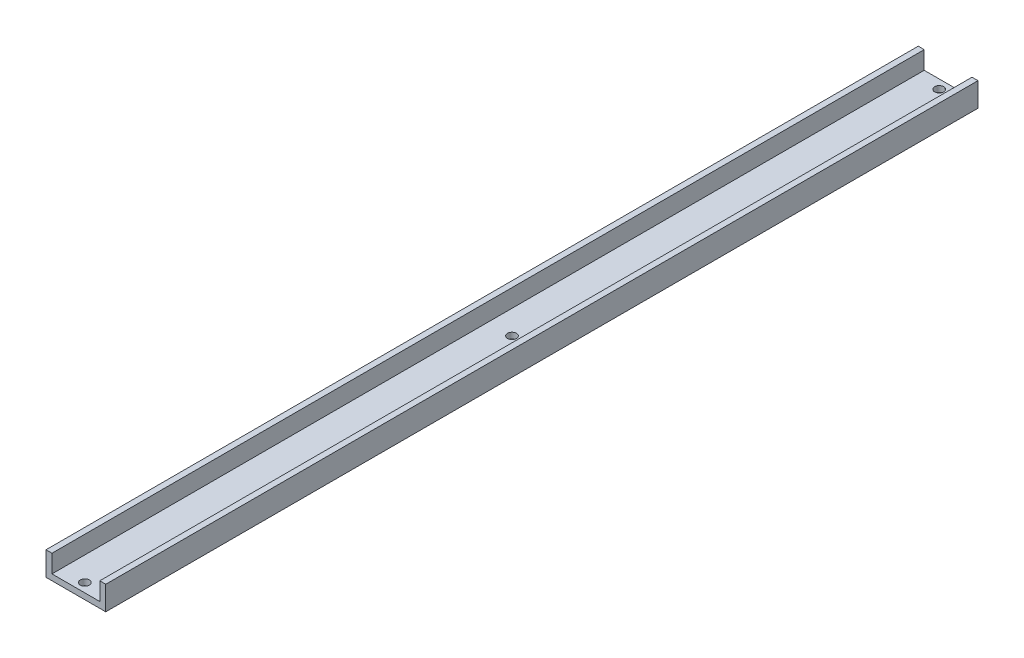
ISO-10303-21;
HEADER;
FILE_DESCRIPTION(('STEP AP214'),'2;1');
FILE_NAME('part.step','',(''),(''),'','','');
FILE_SCHEMA(('AUTOMOTIVE_DESIGN { 1 0 10303 214 1 1 1 1 }'));
ENDSEC;
DATA;
#1=APPLICATION_CONTEXT('core data for automotive mechanical design processes');
#2=APPLICATION_PROTOCOL_DEFINITION('international standard','automotive_design',2000,#1);
#3=PRODUCT_CONTEXT('',#1,'mechanical');
#4=PRODUCT('Part','Part','',(#3));
#5=PRODUCT_RELATED_PRODUCT_CATEGORY('part','',(#4));
#6=PRODUCT_DEFINITION_FORMATION('','',#4);
#7=PRODUCT_DEFINITION_CONTEXT('part definition',#1,'design');
#8=PRODUCT_DEFINITION('design','',#6,#7);
#9=PRODUCT_DEFINITION_SHAPE('','',#8);
#10=(LENGTH_UNIT() NAMED_UNIT(*) SI_UNIT(.MILLI.,.METRE.));
#11=(NAMED_UNIT(*) PLANE_ANGLE_UNIT() SI_UNIT($,.RADIAN.));
#12=(NAMED_UNIT(*) SI_UNIT($,.STERADIAN.) SOLID_ANGLE_UNIT());
#13=UNCERTAINTY_MEASURE_WITH_UNIT(LENGTH_MEASURE(1.E-05),#10,'distance_accuracy_value','');
#14=(GEOMETRIC_REPRESENTATION_CONTEXT(3) GLOBAL_UNCERTAINTY_ASSIGNED_CONTEXT((#13)) GLOBAL_UNIT_ASSIGNED_CONTEXT((#10,
#11,#12)) REPRESENTATION_CONTEXT('',''));
#15=CARTESIAN_POINT('',(0.,0.,0.));
#16=DIRECTION('',(0.,0.,1.));
#17=DIRECTION('',(1.,0.,0.));
#18=AXIS2_PLACEMENT_3D('',#15,#16,#17);
#19=CARTESIAN_POINT('',(0.,0.,463.55));
#20=DIRECTION('',(1.,0.,0.));
#21=DIRECTION('',(0.,0.,-1.));
#22=AXIS2_PLACEMENT_3D('',#19,#20,#21);
#23=PLANE('',#22);
#24=DIRECTION('',(0.,-1.,0.));
#25=VECTOR('',#24,1.);
#26=CARTESIAN_POINT('',(0.,0.,0.));
#27=LINE('',#26,#25);
#28=CARTESIAN_POINT('',(0.,12.7,0.));
#29=VERTEX_POINT('',#28);
#30=CARTESIAN_POINT('',(0.,0.,0.));
#31=VERTEX_POINT('',#30);
#32=EDGE_CURVE('E149',#29,#31,#27,.T.);
#33=ORIENTED_EDGE('',*,*,#32,.T.);
#34=DIRECTION('',(0.,0.,-1.));
#35=VECTOR('',#34,1.);
#36=CARTESIAN_POINT('',(0.,0.,463.55));
#37=LINE('',#36,#35);
#38=CARTESIAN_POINT('',(0.,0.,463.55));
#39=VERTEX_POINT('',#38);
#40=EDGE_CURVE('E11',#39,#31,#37,.T.);
#41=ORIENTED_EDGE('',*,*,#40,.F.);
#42=DIRECTION('',(0.,-1.,0.));
#43=VECTOR('',#42,1.);
#44=CARTESIAN_POINT('',(0.,0.,463.55));
#45=LINE('',#44,#43);
#46=CARTESIAN_POINT('',(0.,12.7,463.55));
#47=VERTEX_POINT('',#46);
#48=EDGE_CURVE('E166',#47,#39,#45,.T.);
#49=ORIENTED_EDGE('',*,*,#48,.F.);
#50=DIRECTION('',(0.,0.,-1.));
#51=VECTOR('',#50,1.);
#52=CARTESIAN_POINT('',(0.,12.7,463.55));
#53=LINE('',#52,#51);
#54=EDGE_CURVE('E145',#47,#29,#53,.T.);
#55=ORIENTED_EDGE('',*,*,#54,.T.);
#56=EDGE_LOOP('',(#33,#41,#49,#55));
#57=FACE_BOUND('',#56,.T.);
#58=ADVANCED_FACE('F39',(#57),#23,.F.);
#59=CARTESIAN_POINT('',(0.,0.,463.55));
#60=DIRECTION('',(0.,1.,0.));
#61=DIRECTION('',(0.,0.,1.));
#62=AXIS2_PLACEMENT_3D('',#59,#60,#61);
#63=PLANE('',#62);
#64=CARTESIAN_POINT('',(15.875,0.,231.775));
#65=DIRECTION('',(0.,1.,0.));
#66=DIRECTION('',(0.,0.,1.));
#67=AXIS2_PLACEMENT_3D('',#64,#65,#66);
#68=CIRCLE('',#67,2.413);
#69=CARTESIAN_POINT('',(15.875,0.,234.188));
#70=VERTEX_POINT('',#69);
#71=EDGE_CURVE('E218',#70,#70,#68,.F.);
#72=ORIENTED_EDGE('',*,*,#71,.F.);
#73=EDGE_LOOP('',(#72));
#74=FACE_BOUND('',#73,.T.);
#75=CARTESIAN_POINT('',(15.875,0.,458.7875));
#76=DIRECTION('',(0.,1.,0.));
#77=DIRECTION('',(0.,0.,1.));
#78=AXIS2_PLACEMENT_3D('',#75,#76,#77);
#79=CIRCLE('',#78,2.41300000000002);
#80=CARTESIAN_POINT('',(15.875,0.,461.2005));
#81=VERTEX_POINT('',#80);
#82=EDGE_CURVE('E153',#81,#81,#79,.F.);
#83=ORIENTED_EDGE('',*,*,#82,.F.);
#84=EDGE_LOOP('',(#83));
#85=FACE_BOUND('',#84,.T.);
#86=CARTESIAN_POINT('',(15.875,0.,4.7625));
#87=DIRECTION('',(0.,1.,0.));
#88=DIRECTION('',(0.,0.,1.));
#89=AXIS2_PLACEMENT_3D('',#86,#87,#88);
#90=CIRCLE('',#89,2.413);
#91=CARTESIAN_POINT('',(15.875,0.,7.1755));
#92=VERTEX_POINT('',#91);
#93=EDGE_CURVE('E210',#92,#92,#90,.F.);
#94=ORIENTED_EDGE('',*,*,#93,.F.);
#95=EDGE_LOOP('',(#94));
#96=FACE_BOUND('',#95,.T.);
#97=DIRECTION('',(1.,0.,0.));
#98=VECTOR('',#97,1.);
#99=CARTESIAN_POINT('',(0.,0.,0.));
#100=LINE('',#99,#98);
#101=CARTESIAN_POINT('',(31.75,0.,0.));
#102=VERTEX_POINT('',#101);
#103=EDGE_CURVE('E152',#31,#102,#100,.T.);
#104=ORIENTED_EDGE('',*,*,#103,.T.);
#105=DIRECTION('',(0.,0.,-1.));
#106=VECTOR('',#105,1.);
#107=CARTESIAN_POINT('',(31.75,0.,463.55));
#108=LINE('',#107,#106);
#109=CARTESIAN_POINT('',(31.75,0.,463.55));
#110=VERTEX_POINT('',#109);
#111=EDGE_CURVE('E48',#110,#102,#108,.T.);
#112=ORIENTED_EDGE('',*,*,#111,.F.);
#113=DIRECTION('',(1.,0.,0.));
#114=VECTOR('',#113,1.);
#115=CARTESIAN_POINT('',(0.,0.,463.55));
#116=LINE('',#115,#114);
#117=EDGE_CURVE('E103',#39,#110,#116,.T.);
#118=ORIENTED_EDGE('',*,*,#117,.F.);
#119=ORIENTED_EDGE('',*,*,#40,.T.);
#120=EDGE_LOOP('',(#104,#112,#118,#119));
#121=FACE_BOUND('',#120,.T.);
#122=ADVANCED_FACE('F249',(#74,#85,#96,#121),#63,.F.);
#123=CARTESIAN_POINT('',(31.75,0.,463.55));
#124=DIRECTION('',(-1.,0.,0.));
#125=DIRECTION('',(0.,0.,1.));
#126=AXIS2_PLACEMENT_3D('',#123,#124,#125);
#127=PLANE('',#126);
#128=DIRECTION('',(0.,1.,0.));
#129=VECTOR('',#128,1.);
#130=CARTESIAN_POINT('',(31.75,0.,0.));
#131=LINE('',#130,#129);
#132=CARTESIAN_POINT('',(31.75,12.7,0.));
#133=VERTEX_POINT('',#132);
#134=EDGE_CURVE('E156',#102,#133,#131,.T.);
#135=ORIENTED_EDGE('',*,*,#134,.T.);
#136=DIRECTION('',(0.,0.,-1.));
#137=VECTOR('',#136,1.);
#138=CARTESIAN_POINT('',(31.75,12.7,463.55));
#139=LINE('',#138,#137);
#140=CARTESIAN_POINT('',(31.75,12.7,463.55));
#141=VERTEX_POINT('',#140);
#142=EDGE_CURVE('E177',#141,#133,#139,.T.);
#143=ORIENTED_EDGE('',*,*,#142,.F.);
#144=DIRECTION('',(0.,1.,0.));
#145=VECTOR('',#144,1.);
#146=CARTESIAN_POINT('',(31.75,0.,463.55));
#147=LINE('',#146,#145);
#148=EDGE_CURVE('E187',#110,#141,#147,.T.);
#149=ORIENTED_EDGE('',*,*,#148,.F.);
#150=ORIENTED_EDGE('',*,*,#111,.T.);
#151=EDGE_LOOP('',(#135,#143,#149,#150));
#152=FACE_BOUND('',#151,.T.);
#153=ADVANCED_FACE('F185',(#152),#127,.F.);
#154=CARTESIAN_POINT('',(31.75,12.7,463.55));
#155=DIRECTION('',(0.,-1.,0.));
#156=DIRECTION('',(0.,0.,-1.));
#157=AXIS2_PLACEMENT_3D('',#154,#155,#156);
#158=PLANE('',#157);
#159=DIRECTION('',(-1.,0.,0.));
#160=VECTOR('',#159,1.);
#161=CARTESIAN_POINT('',(31.75,12.7,0.));
#162=LINE('',#161,#160);
#163=CARTESIAN_POINT('',(28.575,12.7,0.));
#164=VERTEX_POINT('',#163);
#165=EDGE_CURVE('E158',#133,#164,#162,.T.);
#166=ORIENTED_EDGE('',*,*,#165,.T.);
#167=DIRECTION('',(0.,0.,-1.));
#168=VECTOR('',#167,1.);
#169=CARTESIAN_POINT('',(28.575,12.7,463.55));
#170=LINE('',#169,#168);
#171=CARTESIAN_POINT('',(28.575,12.7,463.55));
#172=VERTEX_POINT('',#171);
#173=EDGE_CURVE('E173',#172,#164,#170,.T.);
#174=ORIENTED_EDGE('',*,*,#173,.F.);
#175=DIRECTION('',(-1.,0.,0.));
#176=VECTOR('',#175,1.);
#177=CARTESIAN_POINT('',(31.75,12.7,463.55));
#178=LINE('',#177,#176);
#179=EDGE_CURVE('E200',#141,#172,#178,.T.);
#180=ORIENTED_EDGE('',*,*,#179,.F.);
#181=ORIENTED_EDGE('',*,*,#142,.T.);
#182=EDGE_LOOP('',(#166,#174,#180,#181));
#183=FACE_BOUND('',#182,.T.);
#184=ADVANCED_FACE('F195',(#183),#158,.F.);
#185=CARTESIAN_POINT('',(28.575,3.175,463.55));
#186=DIRECTION('',(1.,0.,0.));
#187=DIRECTION('',(0.,0.,-1.));
#188=AXIS2_PLACEMENT_3D('',#185,#186,#187);
#189=PLANE('',#188);
#190=DIRECTION('',(0.,-1.,0.));
#191=VECTOR('',#190,1.);
#192=CARTESIAN_POINT('',(28.575,3.175,0.));
#193=LINE('',#192,#191);
#194=CARTESIAN_POINT('',(28.575,3.175,0.));
#195=VERTEX_POINT('',#194);
#196=EDGE_CURVE('E160',#164,#195,#193,.T.);
#197=ORIENTED_EDGE('',*,*,#196,.T.);
#198=DIRECTION('',(0.,0.,-1.));
#199=VECTOR('',#198,1.);
#200=CARTESIAN_POINT('',(28.575,3.175,463.55));
#201=LINE('',#200,#199);
#202=CARTESIAN_POINT('',(28.575,3.175,463.55));
#203=VERTEX_POINT('',#202);
#204=EDGE_CURVE('E137',#203,#195,#201,.T.);
#205=ORIENTED_EDGE('',*,*,#204,.F.);
#206=DIRECTION('',(0.,-1.,0.));
#207=VECTOR('',#206,1.);
#208=CARTESIAN_POINT('',(28.575,3.175,463.55));
#209=LINE('',#208,#207);
#210=EDGE_CURVE('E126',#172,#203,#209,.T.);
#211=ORIENTED_EDGE('',*,*,#210,.F.);
#212=ORIENTED_EDGE('',*,*,#173,.T.);
#213=EDGE_LOOP('',(#197,#205,#211,#212));
#214=FACE_BOUND('',#213,.T.);
#215=ADVANCED_FACE('F198',(#214),#189,.F.);
#216=CARTESIAN_POINT('',(3.175,3.175,463.55));
#217=DIRECTION('',(0.,-1.,0.));
#218=DIRECTION('',(0.,0.,-1.));
#219=AXIS2_PLACEMENT_3D('',#216,#217,#218);
#220=PLANE('',#219);
#221=CARTESIAN_POINT('',(15.875,3.175,231.775));
#222=DIRECTION('',(0.,1.,0.));
#223=DIRECTION('',(0.,0.,1.));
#224=AXIS2_PLACEMENT_3D('',#221,#222,#223);
#225=CIRCLE('',#224,2.413);
#226=CARTESIAN_POINT('',(15.875,3.175,234.188));
#227=VERTEX_POINT('',#226);
#228=EDGE_CURVE('E227',#227,#227,#225,.T.);
#229=ORIENTED_EDGE('',*,*,#228,.F.);
#230=EDGE_LOOP('',(#229));
#231=FACE_BOUND('',#230,.T.);
#232=CARTESIAN_POINT('',(15.875,3.175,458.7875));
#233=DIRECTION('',(0.,1.,0.));
#234=DIRECTION('',(0.,0.,1.));
#235=AXIS2_PLACEMENT_3D('',#232,#233,#234);
#236=CIRCLE('',#235,2.41300000000002);
#237=CARTESIAN_POINT('',(15.875,3.175,461.2005));
#238=VERTEX_POINT('',#237);
#239=EDGE_CURVE('E214',#238,#238,#236,.T.);
#240=ORIENTED_EDGE('',*,*,#239,.F.);
#241=EDGE_LOOP('',(#240));
#242=FACE_BOUND('',#241,.T.);
#243=CARTESIAN_POINT('',(15.875,3.175,4.7625));
#244=DIRECTION('',(0.,1.,0.));
#245=DIRECTION('',(0.,0.,1.));
#246=AXIS2_PLACEMENT_3D('',#243,#244,#245);
#247=CIRCLE('',#246,2.413);
#248=CARTESIAN_POINT('',(15.875,3.175,7.1755));
#249=VERTEX_POINT('',#248);
#250=EDGE_CURVE('E215',#249,#249,#247,.T.);
#251=ORIENTED_EDGE('',*,*,#250,.F.);
#252=EDGE_LOOP('',(#251));
#253=FACE_BOUND('',#252,.T.);
#254=DIRECTION('',(-1.,0.,0.));
#255=VECTOR('',#254,1.);
#256=CARTESIAN_POINT('',(3.175,3.175,0.));
#257=LINE('',#256,#255);
#258=CARTESIAN_POINT('',(3.175,3.175,0.));
#259=VERTEX_POINT('',#258);
#260=EDGE_CURVE('E135',#195,#259,#257,.T.);
#261=ORIENTED_EDGE('',*,*,#260,.T.);
#262=DIRECTION('',(0.,0.,-1.));
#263=VECTOR('',#262,1.);
#264=CARTESIAN_POINT('',(3.175,3.175,463.55));
#265=LINE('',#264,#263);
#266=CARTESIAN_POINT('',(3.175,3.175,463.55));
#267=VERTEX_POINT('',#266);
#268=EDGE_CURVE('E132',#267,#259,#265,.T.);
#269=ORIENTED_EDGE('',*,*,#268,.F.);
#270=DIRECTION('',(-1.,0.,0.));
#271=VECTOR('',#270,1.);
#272=CARTESIAN_POINT('',(3.175,3.175,463.55));
#273=LINE('',#272,#271);
#274=EDGE_CURVE('E120',#203,#267,#273,.T.);
#275=ORIENTED_EDGE('',*,*,#274,.F.);
#276=ORIENTED_EDGE('',*,*,#204,.T.);
#277=EDGE_LOOP('',(#261,#269,#275,#276));
#278=FACE_BOUND('',#277,.T.);
#279=ADVANCED_FACE('F133',(#231,#242,#253,#278),#220,.F.);
#280=CARTESIAN_POINT('',(3.175,3.175,463.55));
#281=DIRECTION('',(-1.,0.,0.));
#282=DIRECTION('',(0.,0.,1.));
#283=AXIS2_PLACEMENT_3D('',#280,#281,#282);
#284=PLANE('',#283);
#285=DIRECTION('',(0.,1.,0.));
#286=VECTOR('',#285,1.);
#287=CARTESIAN_POINT('',(3.175,3.175,0.));
#288=LINE('',#287,#286);
#289=CARTESIAN_POINT('',(3.175,12.7,0.));
#290=VERTEX_POINT('',#289);
#291=EDGE_CURVE('E88',#259,#290,#288,.T.);
#292=ORIENTED_EDGE('',*,*,#291,.T.);
#293=DIRECTION('',(0.,0.,-1.));
#294=VECTOR('',#293,1.);
#295=CARTESIAN_POINT('',(3.175,12.7,463.55));
#296=LINE('',#295,#294);
#297=CARTESIAN_POINT('',(3.175,12.7,463.55));
#298=VERTEX_POINT('',#297);
#299=EDGE_CURVE('E138',#298,#290,#296,.T.);
#300=ORIENTED_EDGE('',*,*,#299,.F.);
#301=DIRECTION('',(0.,1.,0.));
#302=VECTOR('',#301,1.);
#303=CARTESIAN_POINT('',(3.175,3.175,463.55));
#304=LINE('',#303,#302);
#305=EDGE_CURVE('E124',#267,#298,#304,.T.);
#306=ORIENTED_EDGE('',*,*,#305,.F.);
#307=ORIENTED_EDGE('',*,*,#268,.T.);
#308=EDGE_LOOP('',(#292,#300,#306,#307));
#309=FACE_BOUND('',#308,.T.);
#310=ADVANCED_FACE('F140',(#309),#284,.F.);
#311=CARTESIAN_POINT('',(0.,12.7,463.55));
#312=DIRECTION('',(0.,-1.,0.));
#313=DIRECTION('',(0.,0.,-1.));
#314=AXIS2_PLACEMENT_3D('',#311,#312,#313);
#315=PLANE('',#314);
#316=DIRECTION('',(-1.,0.,0.));
#317=VECTOR('',#316,1.);
#318=CARTESIAN_POINT('',(0.,12.7,0.));
#319=LINE('',#318,#317);
#320=EDGE_CURVE('E94',#290,#29,#319,.T.);
#321=ORIENTED_EDGE('',*,*,#320,.T.);
#322=ORIENTED_EDGE('',*,*,#54,.F.);
#323=DIRECTION('',(-1.,0.,0.));
#324=VECTOR('',#323,1.);
#325=CARTESIAN_POINT('',(0.,12.7,463.55));
#326=LINE('',#325,#324);
#327=EDGE_CURVE('E59',#298,#47,#326,.T.);
#328=ORIENTED_EDGE('',*,*,#327,.F.);
#329=ORIENTED_EDGE('',*,*,#299,.T.);
#330=EDGE_LOOP('',(#321,#322,#328,#329));
#331=FACE_BOUND('',#330,.T.);
#332=ADVANCED_FACE('F255',(#331),#315,.F.);
#333=CARTESIAN_POINT('',(0.,0.,463.55));
#334=DIRECTION('',(0.,0.,-1.));
#335=DIRECTION('',(-1.,0.,0.));
#336=AXIS2_PLACEMENT_3D('',#333,#334,#335);
#337=PLANE('',#336);
#338=ORIENTED_EDGE('',*,*,#48,.T.);
#339=ORIENTED_EDGE('',*,*,#117,.T.);
#340=ORIENTED_EDGE('',*,*,#148,.T.);
#341=ORIENTED_EDGE('',*,*,#179,.T.);
#342=ORIENTED_EDGE('',*,*,#210,.T.);
#343=ORIENTED_EDGE('',*,*,#274,.T.);
#344=ORIENTED_EDGE('',*,*,#305,.T.);
#345=ORIENTED_EDGE('',*,*,#327,.T.);
#346=EDGE_LOOP('',(#338,#339,#340,#341,#342,#343,#344,#345));
#347=FACE_BOUND('',#346,.T.);
#348=ADVANCED_FACE('F122',(#347),#337,.F.);
#349=CARTESIAN_POINT('',(0.,0.,0.));
#350=DIRECTION('',(0.,0.,-1.));
#351=DIRECTION('',(-1.,0.,0.));
#352=AXIS2_PLACEMENT_3D('',#349,#350,#351);
#353=PLANE('',#352);
#354=ORIENTED_EDGE('',*,*,#32,.F.);
#355=ORIENTED_EDGE('',*,*,#320,.F.);
#356=ORIENTED_EDGE('',*,*,#291,.F.);
#357=ORIENTED_EDGE('',*,*,#260,.F.);
#358=ORIENTED_EDGE('',*,*,#196,.F.);
#359=ORIENTED_EDGE('',*,*,#165,.F.);
#360=ORIENTED_EDGE('',*,*,#134,.F.);
#361=ORIENTED_EDGE('',*,*,#103,.F.);
#362=EDGE_LOOP('',(#354,#355,#356,#357,#358,#359,#360,#361));
#363=FACE_BOUND('',#362,.T.);
#364=ADVANCED_FACE('F191',(#363),#353,.T.);
#365=CARTESIAN_POINT('',(15.875,-0.00100000000000013,4.7625));
#366=DIRECTION('',(0.,1.,0.));
#367=DIRECTION('',(0.,0.,1.));
#368=AXIS2_PLACEMENT_3D('',#365,#366,#367);
#369=CYLINDRICAL_SURFACE('',#368,2.413);
#370=ORIENTED_EDGE('',*,*,#250,.T.);
#371=EDGE_LOOP('',(#370));
#372=FACE_BOUND('',#371,.T.);
#373=ORIENTED_EDGE('',*,*,#93,.T.);
#374=EDGE_LOOP('',(#373));
#375=FACE_BOUND('',#374,.T.);
#376=ADVANCED_FACE('F242',(#372,#375),#369,.F.);
#377=CARTESIAN_POINT('',(15.875,-0.00100000000000013,458.7875));
#378=DIRECTION('',(0.,1.,0.));
#379=DIRECTION('',(0.,0.,1.));
#380=AXIS2_PLACEMENT_3D('',#377,#378,#379);
#381=CYLINDRICAL_SURFACE('',#380,2.41300000000002);
#382=ORIENTED_EDGE('',*,*,#239,.T.);
#383=EDGE_LOOP('',(#382));
#384=FACE_BOUND('',#383,.T.);
#385=ORIENTED_EDGE('',*,*,#82,.T.);
#386=EDGE_LOOP('',(#385));
#387=FACE_BOUND('',#386,.T.);
#388=ADVANCED_FACE('F245',(#384,#387),#381,.F.);
#389=CARTESIAN_POINT('',(15.875,-0.00100000000000013,231.775));
#390=DIRECTION('',(0.,1.,0.));
#391=DIRECTION('',(0.,0.,1.));
#392=AXIS2_PLACEMENT_3D('',#389,#390,#391);
#393=CYLINDRICAL_SURFACE('',#392,2.413);
#394=ORIENTED_EDGE('',*,*,#228,.T.);
#395=EDGE_LOOP('',(#394));
#396=FACE_BOUND('',#395,.T.);
#397=ORIENTED_EDGE('',*,*,#71,.T.);
#398=EDGE_LOOP('',(#397));
#399=FACE_BOUND('',#398,.T.);
#400=ADVANCED_FACE('F232',(#396,#399),#393,.F.);
#401=CLOSED_SHELL('',(#58,#122,#153,#184,#215,#279,#310,#332,#348,#364,#376,#388,#400));
#402=MANIFOLD_SOLID_BREP('B2',#401);
#403=ADVANCED_BREP_SHAPE_REPRESENTATION('',(#18,#402),#14);
#404=SHAPE_DEFINITION_REPRESENTATION(#9,#403);
ENDSEC;
END-ISO-10303-21;
